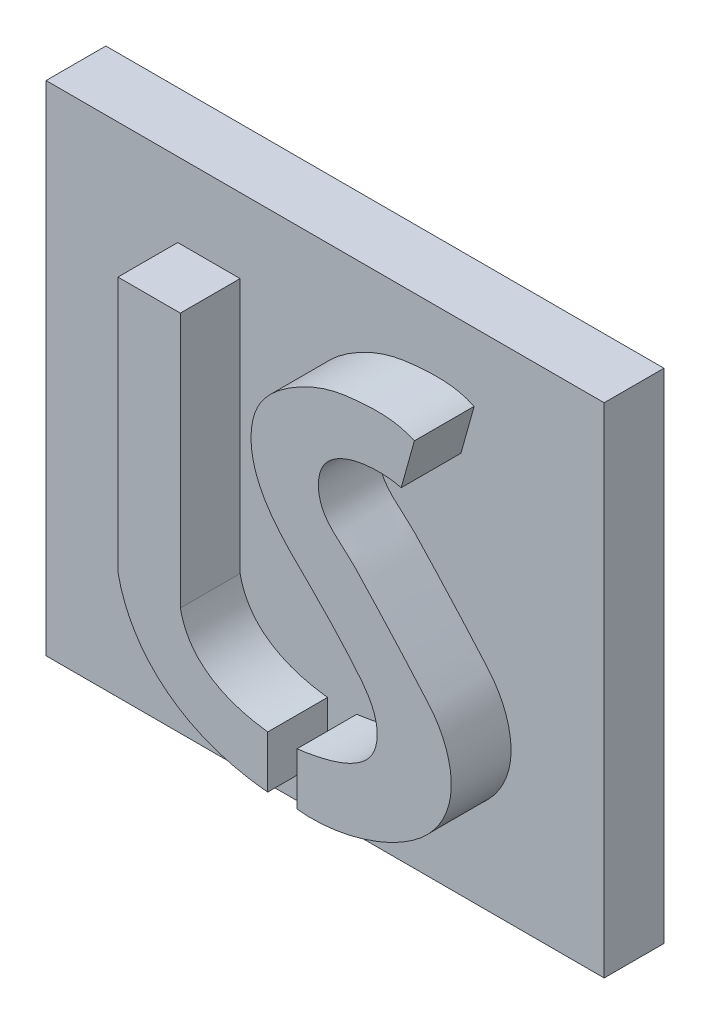
ISO-10303-21;
HEADER;
FILE_DESCRIPTION(('STEP AP214'),'2;1');
FILE_NAME('part.step','',(''),(''),'','','');
FILE_SCHEMA(('AUTOMOTIVE_DESIGN { 1 0 10303 214 1 1 1 1 }'));
ENDSEC;
DATA;
#1=APPLICATION_CONTEXT('core data for automotive mechanical design processes');
#2=APPLICATION_PROTOCOL_DEFINITION('international standard','automotive_design',2000,#1);
#3=PRODUCT_CONTEXT('',#1,'mechanical');
#4=PRODUCT('Part','Part','',(#3));
#5=PRODUCT_RELATED_PRODUCT_CATEGORY('part','',(#4));
#6=PRODUCT_DEFINITION_FORMATION('','',#4);
#7=PRODUCT_DEFINITION_CONTEXT('part definition',#1,'design');
#8=PRODUCT_DEFINITION('design','',#6,#7);
#9=PRODUCT_DEFINITION_SHAPE('','',#8);
#10=(LENGTH_UNIT() NAMED_UNIT(*) SI_UNIT(.MILLI.,.METRE.));
#11=(NAMED_UNIT(*) PLANE_ANGLE_UNIT() SI_UNIT($,.RADIAN.));
#12=(NAMED_UNIT(*) SI_UNIT($,.STERADIAN.) SOLID_ANGLE_UNIT());
#13=UNCERTAINTY_MEASURE_WITH_UNIT(LENGTH_MEASURE(1.E-05),#10,'distance_accuracy_value','');
#14=(GEOMETRIC_REPRESENTATION_CONTEXT(3) GLOBAL_UNCERTAINTY_ASSIGNED_CONTEXT((#13)) GLOBAL_UNIT_ASSIGNED_CONTEXT((#10,
#11,#12)) REPRESENTATION_CONTEXT('',''));
#15=CARTESIAN_POINT('',(0.,0.,0.));
#16=DIRECTION('',(0.,0.,1.));
#17=DIRECTION('',(1.,0.,0.));
#18=AXIS2_PLACEMENT_3D('',#15,#16,#17);
#19=CARTESIAN_POINT('',(-29.5826925903919,-8.44385926575013,3.));
#20=DIRECTION('',(0.,0.,1.));
#21=DIRECTION('',(1.,0.,0.));
#22=AXIS2_PLACEMENT_3D('',#19,#20,#21);
#23=PLANE('',#22);
#24=CARTESIAN_POINT('',(-22.9765195134115,0.,3.));
#25=CARTESIAN_POINT('',(-22.3429501642993,-3.11942697674456,3.));
#26=CARTESIAN_POINT('',(-19.6728785197625,-5.43023383071438,3.));
#27=CARTESIAN_POINT('',(-15.4592463577573,-5.80732246234798,3.));
#28=B_SPLINE_CURVE_WITH_KNOTS('',3,(#24,#25,#26,#27),.UNSPECIFIED.,.F.,.F.,(4,4),(0.,1.),.UNSPECIFIED.);
#29=CARTESIAN_POINT('',(-22.9765195134115,0.,3.));
#30=VERTEX_POINT('',#29);
#31=CARTESIAN_POINT('',(-15.4592463577573,-5.80732246234798,3.));
#32=VERTEX_POINT('',#31);
#33=EDGE_CURVE('E163',#30,#32,#28,.T.);
#34=ORIENTED_EDGE('',*,*,#33,.F.);
#35=DIRECTION('',(0.,-1.,0.));
#36=VECTOR('',#35,1.);
#37=CARTESIAN_POINT('',(-22.9765195134115,12.8177735507663,3.));
#38=LINE('',#37,#36);
#39=CARTESIAN_POINT('',(-22.9765195134115,12.8177735507663,3.));
#40=VERTEX_POINT('',#39);
#41=EDGE_CURVE('E160',#40,#30,#38,.T.);
#42=ORIENTED_EDGE('',*,*,#41,.F.);
#43=DIRECTION('',(-1.,0.,0.));
#44=VECTOR('',#43,1.);
#45=CARTESIAN_POINT('',(-22.9765195134115,12.8177735507663,3.));
#46=LINE('',#45,#44);
#47=CARTESIAN_POINT('',(-19.8443223652222,12.8177735507663,3.));
#48=VERTEX_POINT('',#47);
#49=EDGE_CURVE('E172',#48,#40,#46,.T.);
#50=ORIENTED_EDGE('',*,*,#49,.F.);
#51=DIRECTION('',(0.,1.,0.));
#52=VECTOR('',#51,1.);
#53=CARTESIAN_POINT('',(-19.8443223652222,12.8177735507663,3.));
#54=LINE('',#53,#52);
#55=CARTESIAN_POINT('',(-19.8443223652222,0.,3.));
#56=VERTEX_POINT('',#55);
#57=EDGE_CURVE('E341',#56,#48,#54,.T.);
#58=ORIENTED_EDGE('',*,*,#57,.F.);
#59=CARTESIAN_POINT('',(-15.4592463577573,-3.19123409553421,3.));
#60=CARTESIAN_POINT('',(-18.4198953362337,-2.82839401007701,3.));
#61=CARTESIAN_POINT('',(-19.5543136151055,-1.44123784440447,3.));
#62=CARTESIAN_POINT('',(-19.8443223652222,0.,3.));
#63=B_SPLINE_CURVE_WITH_KNOTS('',3,(#59,#60,#61,#62),.UNSPECIFIED.,.F.,.F.,(4,4),(0.,1.),.UNSPECIFIED.);
#64=CARTESIAN_POINT('',(-15.4592463577573,-3.19123409553421,3.));
#65=VERTEX_POINT('',#64);
#66=EDGE_CURVE('E337',#65,#56,#63,.T.);
#67=ORIENTED_EDGE('',*,*,#66,.F.);
#68=DIRECTION('',(0.,1.,0.));
#69=VECTOR('',#68,1.);
#70=CARTESIAN_POINT('',(-15.4592463577573,-5.80732246234798,3.));
#71=LINE('',#70,#69);
#72=EDGE_CURVE('E332',#32,#65,#71,.T.);
#73=ORIENTED_EDGE('',*,*,#72,.F.);
#74=EDGE_LOOP('',(#34,#42,#50,#58,#67,#73));
#75=FACE_BOUND('',#74,.T.);
#76=DIRECTION('',(0.,-1.,0.));
#77=VECTOR('',#76,1.);
#78=CARTESIAN_POINT('',(-29.5826925903919,16.5561407342499,3.));
#79=LINE('',#78,#77);
#80=CARTESIAN_POINT('',(-29.5826925903919,16.5561407342499,3.));
#81=VERTEX_POINT('',#80);
#82=CARTESIAN_POINT('',(-29.5826925903919,-8.44385926575013,3.));
#83=VERTEX_POINT('',#82);
#84=EDGE_CURVE('E233',#81,#83,#79,.T.);
#85=ORIENTED_EDGE('',*,*,#84,.T.);
#86=DIRECTION('',(1.,0.,0.));
#87=VECTOR('',#86,1.);
#88=CARTESIAN_POINT('',(-29.5826925903919,-8.44385926575013,3.));
#89=LINE('',#88,#87);
#90=CARTESIAN_POINT('',(-1.57743360817238,-8.44385926575013,3.));
#91=VERTEX_POINT('',#90);
#92=EDGE_CURVE('E247',#83,#91,#89,.T.);
#93=ORIENTED_EDGE('',*,*,#92,.T.);
#94=DIRECTION('',(0.,1.,0.));
#95=VECTOR('',#94,1.);
#96=CARTESIAN_POINT('',(-1.57743360817238,16.5561407342499,3.));
#97=LINE('',#96,#95);
#98=CARTESIAN_POINT('',(-1.57743360817238,16.5561407342499,3.));
#99=VERTEX_POINT('',#98);
#100=EDGE_CURVE('E228',#91,#99,#97,.T.);
#101=ORIENTED_EDGE('',*,*,#100,.T.);
#102=DIRECTION('',(-1.,0.,0.));
#103=VECTOR('',#102,1.);
#104=CARTESIAN_POINT('',(-29.5826925903919,16.5561407342499,3.));
#105=LINE('',#104,#103);
#106=EDGE_CURVE('E240',#99,#81,#105,.T.);
#107=ORIENTED_EDGE('',*,*,#106,.T.);
#108=EDGE_LOOP('',(#85,#93,#101,#107));
#109=FACE_BOUND('',#108,.T.);
#110=DIRECTION('',(0.268798967813945,0.963196301333304,0.));
#111=VECTOR('',#110,1.);
#112=CARTESIAN_POINT('',(-8.7624334278442,10.7700605483656,3.));
#113=LINE('',#112,#111);
#114=CARTESIAN_POINT('',(-8.7624334278442,10.7700605483656,3.));
#115=VERTEX_POINT('',#114);
#116=CARTESIAN_POINT('',(-8.10172784651106,13.137588881476,3.));
#117=VERTEX_POINT('',#116);
#118=EDGE_CURVE('E261',#115,#117,#113,.T.);
#119=ORIENTED_EDGE('',*,*,#118,.F.);
#120=CARTESIAN_POINT('',(-13.9930192800649,-5.80732246234798,3.));
#121=CARTESIAN_POINT('',(-11.9839659853003,-6.05433101773536,3.));
#122=CARTESIAN_POINT('',(-7.97562640166888,-4.84318381194574,3.));
#123=CARTESIAN_POINT('',(-6.41692562082773,-2.34626485384229,3.));
#124=CARTESIAN_POINT('',(-6.14186244538643,-0.442680706746581,3.));
#125=CARTESIAN_POINT('',(-6.57837550047113,1.12461989580706,3.));
#126=CARTESIAN_POINT('',(-8.61186699052037,3.47877203101136,3.));
#127=CARTESIAN_POINT('',(-9.73750942511831,4.70756901315383,3.));
#128=CARTESIAN_POINT('',(-11.5566524553808,6.6734283439871,3.));
#129=CARTESIAN_POINT('',(-12.951560908196,7.60981912584689,3.));
#130=CARTESIAN_POINT('',(-13.0064858148123,9.7895302217087,3.));
#131=CARTESIAN_POINT('',(-11.2133193186636,11.0081482727677,3.));
#132=CARTESIAN_POINT('',(-9.39788975937952,10.9473971990266,3.));
#133=CARTESIAN_POINT('',(-8.7624334278442,10.7700605483656,3.));
#134=B_SPLINE_CURVE_WITH_KNOTS('',3,(#120,#121,#122,#123,#124,#125,#126,#127,#128,#129,#130,
#131,#132,#133),.UNSPECIFIED.,.F.,.F.,(4,1,1,1,1,1,1,1,1,1,1,4),(0.,0.199547372977158,
0.300843584674083,0.326269257012473,0.428378424022668,0.465295503558659,0.658522972836398,
0.691498048738816,0.770892828923119,0.837392887247091,0.898086999486631,1.),.UNSPECIFIED.);
#135=CARTESIAN_POINT('',(-13.9930192800649,-5.80732246234798,3.));
#136=VERTEX_POINT('',#135);
#137=EDGE_CURVE('E158',#136,#115,#134,.T.);
#138=ORIENTED_EDGE('',*,*,#137,.F.);
#139=DIRECTION('',(0.,-1.,0.));
#140=VECTOR('',#139,1.);
#141=CARTESIAN_POINT('',(-13.9930192800649,-3.19123409553421,3.));
#142=LINE('',#141,#140);
#143=CARTESIAN_POINT('',(-13.9930192800649,-3.19123409553421,3.));
#144=VERTEX_POINT('',#143);
#145=EDGE_CURVE('E154',#144,#136,#142,.T.);
#146=ORIENTED_EDGE('',*,*,#145,.F.);
#147=CARTESIAN_POINT('',(-8.10172784651106,13.137588881476,3.));
#148=CARTESIAN_POINT('',(-8.92482833659311,13.5189323684147,3.));
#149=CARTESIAN_POINT('',(-10.3336570477235,13.5345127960297,3.));
#150=CARTESIAN_POINT('',(-12.469375349314,13.2846881459409,3.));
#151=CARTESIAN_POINT('',(-14.3642771918677,12.4378341736718,3.));
#152=CARTESIAN_POINT('',(-16.1970350014759,10.8959657458683,3.));
#153=CARTESIAN_POINT('',(-16.4329048290198,8.5121889487889,3.));
#154=CARTESIAN_POINT('',(-15.4102913443083,6.1855625168523,3.));
#155=CARTESIAN_POINT('',(-13.2808511957244,4.22165771458455,3.));
#156=CARTESIAN_POINT('',(-11.3571842829028,2.17038432709639,3.));
#157=CARTESIAN_POINT('',(-9.88647667912001,0.330842149799267,3.));
#158=CARTESIAN_POINT('',(-10.0232360565103,-2.58947903004189,3.));
#159=CARTESIAN_POINT('',(-12.9475231240408,-3.04635590726591,3.));
#160=CARTESIAN_POINT('',(-13.9930192800649,-3.19123409553421,3.));
#161=B_SPLINE_CURVE_WITH_KNOTS('',3,(#147,#148,#149,#150,#151,#152,#153,#154,#155,#156,#157,
#158,#159,#160),.UNSPECIFIED.,.F.,.F.,(4,1,1,1,1,1,1,1,1,1,1,4),(0.,0.0959751847192169,
0.152801719733179,0.233791993128749,0.321873122400391,0.398877795270022,0.476755317251711,
0.592890402931204,0.710882461862937,0.789460509483729,0.840629791422254,1.),.UNSPECIFIED.);
#162=EDGE_CURVE('E263',#117,#144,#161,.T.);
#163=ORIENTED_EDGE('',*,*,#162,.F.);
#164=EDGE_LOOP('',(#119,#138,#146,#163));
#165=FACE_BOUND('',#164,.T.);
#166=ADVANCED_FACE('F33',(#75,#109,#165),#23,.T.);
#167=CARTESIAN_POINT('',(-29.5826925903919,16.5561407342499,3.));
#168=DIRECTION('',(1.,0.,0.));
#169=DIRECTION('',(0.,1.,0.));
#170=AXIS2_PLACEMENT_3D('',#167,#168,#169);
#171=PLANE('',#170);
#172=DIRECTION('',(0.,-1.,0.));
#173=VECTOR('',#172,1.);
#174=CARTESIAN_POINT('',(-29.5826925903919,16.5561407342499,0.));
#175=LINE('',#174,#173);
#176=CARTESIAN_POINT('',(-29.5826925903919,16.5561407342499,0.));
#177=VERTEX_POINT('',#176);
#178=CARTESIAN_POINT('',(-29.5826925903919,-8.44385926575013,0.));
#179=VERTEX_POINT('',#178);
#180=EDGE_CURVE('E224',#177,#179,#175,.T.);
#181=ORIENTED_EDGE('',*,*,#180,.T.);
#182=DIRECTION('',(0.,0.,-1.));
#183=VECTOR('',#182,1.);
#184=CARTESIAN_POINT('',(-29.5826925903919,-8.44385926575013,3.));
#185=LINE('',#184,#183);
#186=EDGE_CURVE('E11',#83,#179,#185,.T.);
#187=ORIENTED_EDGE('',*,*,#186,.F.);
#188=ORIENTED_EDGE('',*,*,#84,.F.);
#189=DIRECTION('',(0.,0.,-1.));
#190=VECTOR('',#189,1.);
#191=CARTESIAN_POINT('',(-29.5826925903919,16.5561407342499,3.));
#192=LINE('',#191,#190);
#193=EDGE_CURVE('E237',#81,#177,#192,.T.);
#194=ORIENTED_EDGE('',*,*,#193,.T.);
#195=EDGE_LOOP('',(#181,#187,#188,#194));
#196=FACE_BOUND('',#195,.T.);
#197=ADVANCED_FACE('F35',(#196),#171,.F.);
#198=CARTESIAN_POINT('',(-29.5826925903919,-8.44385926575013,3.));
#199=DIRECTION('',(0.,1.,0.));
#200=DIRECTION('',(0.,0.,1.));
#201=AXIS2_PLACEMENT_3D('',#198,#199,#200);
#202=PLANE('',#201);
#203=DIRECTION('',(1.,0.,0.));
#204=VECTOR('',#203,1.);
#205=CARTESIAN_POINT('',(-29.5826925903919,-8.44385926575013,0.));
#206=LINE('',#205,#204);
#207=CARTESIAN_POINT('',(-1.57743360817238,-8.44385926575013,0.));
#208=VERTEX_POINT('',#207);
#209=EDGE_CURVE('E216',#179,#208,#206,.T.);
#210=ORIENTED_EDGE('',*,*,#209,.T.);
#211=DIRECTION('',(0.,0.,-1.));
#212=VECTOR('',#211,1.);
#213=CARTESIAN_POINT('',(-1.57743360817238,-8.44385926575013,3.));
#214=LINE('',#213,#212);
#215=EDGE_CURVE('E41',#91,#208,#214,.T.);
#216=ORIENTED_EDGE('',*,*,#215,.F.);
#217=ORIENTED_EDGE('',*,*,#92,.F.);
#218=ORIENTED_EDGE('',*,*,#186,.T.);
#219=EDGE_LOOP('',(#210,#216,#217,#218));
#220=FACE_BOUND('',#219,.T.);
#221=ADVANCED_FACE('F207',(#220),#202,.F.);
#222=CARTESIAN_POINT('',(-1.57743360817238,16.5561407342499,3.));
#223=DIRECTION('',(-1.,0.,0.));
#224=DIRECTION('',(0.,-1.,0.));
#225=AXIS2_PLACEMENT_3D('',#222,#223,#224);
#226=PLANE('',#225);
#227=DIRECTION('',(0.,1.,0.));
#228=VECTOR('',#227,1.);
#229=CARTESIAN_POINT('',(-1.57743360817238,16.5561407342499,0.));
#230=LINE('',#229,#228);
#231=CARTESIAN_POINT('',(-1.57743360817238,16.5561407342499,0.));
#232=VERTEX_POINT('',#231);
#233=EDGE_CURVE('E223',#208,#232,#230,.T.);
#234=ORIENTED_EDGE('',*,*,#233,.T.);
#235=DIRECTION('',(0.,0.,-1.));
#236=VECTOR('',#235,1.);
#237=CARTESIAN_POINT('',(-1.57743360817238,16.5561407342499,3.));
#238=LINE('',#237,#236);
#239=EDGE_CURVE('E229',#99,#232,#238,.T.);
#240=ORIENTED_EDGE('',*,*,#239,.F.);
#241=ORIENTED_EDGE('',*,*,#100,.F.);
#242=ORIENTED_EDGE('',*,*,#215,.T.);
#243=EDGE_LOOP('',(#234,#240,#241,#242));
#244=FACE_BOUND('',#243,.T.);
#245=ADVANCED_FACE('F204',(#244),#226,.F.);
#246=CARTESIAN_POINT('',(-29.5826925903919,16.5561407342499,3.));
#247=DIRECTION('',(0.,-1.,0.));
#248=DIRECTION('',(0.,0.,-1.));
#249=AXIS2_PLACEMENT_3D('',#246,#247,#248);
#250=PLANE('',#249);
#251=DIRECTION('',(-1.,0.,0.));
#252=VECTOR('',#251,1.);
#253=CARTESIAN_POINT('',(-29.5826925903919,16.5561407342499,0.));
#254=LINE('',#253,#252);
#255=EDGE_CURVE('E231',#232,#177,#254,.T.);
#256=ORIENTED_EDGE('',*,*,#255,.T.);
#257=ORIENTED_EDGE('',*,*,#193,.F.);
#258=ORIENTED_EDGE('',*,*,#106,.F.);
#259=ORIENTED_EDGE('',*,*,#239,.T.);
#260=EDGE_LOOP('',(#256,#257,#258,#259));
#261=FACE_BOUND('',#260,.T.);
#262=ADVANCED_FACE('F200',(#261),#250,.F.);
#263=CARTESIAN_POINT('',(-29.5826925903919,-8.44385926575013,0.));
#264=DIRECTION('',(0.,0.,1.));
#265=DIRECTION('',(1.,0.,0.));
#266=AXIS2_PLACEMENT_3D('',#263,#264,#265);
#267=PLANE('',#266);
#268=ORIENTED_EDGE('',*,*,#180,.F.);
#269=ORIENTED_EDGE('',*,*,#255,.F.);
#270=ORIENTED_EDGE('',*,*,#233,.F.);
#271=ORIENTED_EDGE('',*,*,#209,.F.);
#272=EDGE_LOOP('',(#268,#269,#270,#271));
#273=FACE_BOUND('',#272,.T.);
#274=ADVANCED_FACE('F193',(#273),#267,.F.);
#275=CARTESIAN_POINT('',(-22.9765195134115,12.8177735507663,6.));
#276=DIRECTION('',(1.,0.,0.));
#277=DIRECTION('',(0.,0.,-1.));
#278=AXIS2_PLACEMENT_3D('',#275,#276,#277);
#279=PLANE('',#278);
#280=ORIENTED_EDGE('',*,*,#41,.T.);
#281=DIRECTION('',(0.,0.,-1.));
#282=VECTOR('',#281,1.);
#283=CARTESIAN_POINT('',(-22.9765195134115,0.,6.));
#284=LINE('',#283,#282);
#285=CARTESIAN_POINT('',(-22.9765195134115,0.,6.));
#286=VERTEX_POINT('',#285);
#287=EDGE_CURVE('E250',#286,#30,#284,.T.);
#288=ORIENTED_EDGE('',*,*,#287,.F.);
#289=DIRECTION('',(0.,-1.,0.));
#290=VECTOR('',#289,1.);
#291=CARTESIAN_POINT('',(-22.9765195134115,12.8177735507663,6.));
#292=LINE('',#291,#290);
#293=CARTESIAN_POINT('',(-22.9765195134115,12.8177735507663,6.));
#294=VERTEX_POINT('',#293);
#295=EDGE_CURVE('E168',#294,#286,#292,.T.);
#296=ORIENTED_EDGE('',*,*,#295,.F.);
#297=DIRECTION('',(0.,0.,-1.));
#298=VECTOR('',#297,1.);
#299=CARTESIAN_POINT('',(-22.9765195134115,12.8177735507663,6.));
#300=LINE('',#299,#298);
#301=EDGE_CURVE('E327',#294,#40,#300,.T.);
#302=ORIENTED_EDGE('',*,*,#301,.T.);
#303=EDGE_LOOP('',(#280,#288,#296,#302));
#304=FACE_BOUND('',#303,.T.);
#305=ADVANCED_FACE('F188',(#304),#279,.F.);
#306=CARTESIAN_POINT('',(-22.9765195134115,0.,6.));
#307=CARTESIAN_POINT('',(-22.3429501642993,-3.11942697674456,6.));
#308=CARTESIAN_POINT('',(-19.6728785197625,-5.43023383071438,6.));
#309=CARTESIAN_POINT('',(-15.4592463577573,-5.80732246234798,6.));
#310=B_SPLINE_CURVE_WITH_KNOTS('',3,(#306,#307,#308,#309),.UNSPECIFIED.,.F.,.F.,(4,4),(0.,1.),.UNSPECIFIED.);
#311=DIRECTION('',(0.,0.,-1.));
#312=VECTOR('',#311,1.);
#313=SURFACE_OF_LINEAR_EXTRUSION('',#310,#312);
#314=ORIENTED_EDGE('',*,*,#33,.T.);
#315=DIRECTION('',(0.,0.,-1.));
#316=VECTOR('',#315,1.);
#317=CARTESIAN_POINT('',(-15.4592463577573,-5.80732246234798,6.));
#318=LINE('',#317,#316);
#319=CARTESIAN_POINT('',(-15.4592463577573,-5.80732246234798,6.));
#320=VERTEX_POINT('',#319);
#321=EDGE_CURVE('E251',#320,#32,#318,.T.);
#322=ORIENTED_EDGE('',*,*,#321,.F.);
#323=EDGE_CURVE('E171',#286,#320,#310,.T.);
#324=ORIENTED_EDGE('',*,*,#323,.F.);
#325=ORIENTED_EDGE('',*,*,#287,.T.);
#326=EDGE_LOOP('',(#314,#322,#324,#325));
#327=FACE_BOUND('',#326,.T.);
#328=ADVANCED_FACE('F183',(#327),#313,.F.);
#329=CARTESIAN_POINT('',(-15.4592463577573,-5.80732246234798,6.));
#330=DIRECTION('',(-1.,0.,0.));
#331=DIRECTION('',(0.,0.,1.));
#332=AXIS2_PLACEMENT_3D('',#329,#330,#331);
#333=PLANE('',#332);
#334=ORIENTED_EDGE('',*,*,#72,.T.);
#335=DIRECTION('',(0.,0.,-1.));
#336=VECTOR('',#335,1.);
#337=CARTESIAN_POINT('',(-15.4592463577573,-3.19123409553421,6.));
#338=LINE('',#337,#336);
#339=CARTESIAN_POINT('',(-15.4592463577573,-3.19123409553421,6.));
#340=VERTEX_POINT('',#339);
#341=EDGE_CURVE('E255',#340,#65,#338,.T.);
#342=ORIENTED_EDGE('',*,*,#341,.F.);
#343=DIRECTION('',(0.,1.,0.));
#344=VECTOR('',#343,1.);
#345=CARTESIAN_POINT('',(-15.4592463577573,-5.80732246234798,6.));
#346=LINE('',#345,#344);
#347=EDGE_CURVE('E177',#320,#340,#346,.T.);
#348=ORIENTED_EDGE('',*,*,#347,.F.);
#349=ORIENTED_EDGE('',*,*,#321,.T.);
#350=EDGE_LOOP('',(#334,#342,#348,#349));
#351=FACE_BOUND('',#350,.T.);
#352=ADVANCED_FACE('F187',(#351),#333,.F.);
#353=CARTESIAN_POINT('',(-15.4592463577573,-3.19123409553421,6.));
#354=CARTESIAN_POINT('',(-18.4198953362337,-2.82839401007701,6.));
#355=CARTESIAN_POINT('',(-19.5543136151055,-1.44123784440447,6.));
#356=CARTESIAN_POINT('',(-19.8443223652222,0.,6.));
#357=B_SPLINE_CURVE_WITH_KNOTS('',3,(#353,#354,#355,#356),.UNSPECIFIED.,.F.,.F.,(4,4),(0.,1.),.UNSPECIFIED.);
#358=DIRECTION('',(0.,0.,-1.));
#359=VECTOR('',#358,1.);
#360=SURFACE_OF_LINEAR_EXTRUSION('',#357,#359);
#361=ORIENTED_EDGE('',*,*,#66,.T.);
#362=DIRECTION('',(0.,0.,-1.));
#363=VECTOR('',#362,1.);
#364=CARTESIAN_POINT('',(-19.8443223652222,0.,6.));
#365=LINE('',#364,#363);
#366=CARTESIAN_POINT('',(-19.8443223652222,0.,6.));
#367=VERTEX_POINT('',#366);
#368=EDGE_CURVE('E350',#367,#56,#365,.T.);
#369=ORIENTED_EDGE('',*,*,#368,.F.);
#370=EDGE_CURVE('E316',#340,#367,#357,.T.);
#371=ORIENTED_EDGE('',*,*,#370,.F.);
#372=ORIENTED_EDGE('',*,*,#341,.T.);
#373=EDGE_LOOP('',(#361,#369,#371,#372));
#374=FACE_BOUND('',#373,.T.);
#375=ADVANCED_FACE('F312',(#374),#360,.F.);
#376=CARTESIAN_POINT('',(-19.8443223652222,12.8177735507663,6.));
#377=DIRECTION('',(-1.,0.,0.));
#378=DIRECTION('',(0.,0.,1.));
#379=AXIS2_PLACEMENT_3D('',#376,#377,#378);
#380=PLANE('',#379);
#381=ORIENTED_EDGE('',*,*,#57,.T.);
#382=DIRECTION('',(0.,0.,-1.));
#383=VECTOR('',#382,1.);
#384=CARTESIAN_POINT('',(-19.8443223652222,12.8177735507663,6.));
#385=LINE('',#384,#383);
#386=CARTESIAN_POINT('',(-19.8443223652222,12.8177735507663,6.));
#387=VERTEX_POINT('',#386);
#388=EDGE_CURVE('E56',#387,#48,#385,.T.);
#389=ORIENTED_EDGE('',*,*,#388,.F.);
#390=DIRECTION('',(0.,1.,0.));
#391=VECTOR('',#390,1.);
#392=CARTESIAN_POINT('',(-19.8443223652222,12.8177735507663,6.));
#393=LINE('',#392,#391);
#394=EDGE_CURVE('E321',#367,#387,#393,.T.);
#395=ORIENTED_EDGE('',*,*,#394,.F.);
#396=ORIENTED_EDGE('',*,*,#368,.T.);
#397=EDGE_LOOP('',(#381,#389,#395,#396));
#398=FACE_BOUND('',#397,.T.);
#399=ADVANCED_FACE('F310',(#398),#380,.F.);
#400=CARTESIAN_POINT('',(-22.9765195134115,12.8177735507663,6.));
#401=DIRECTION('',(0.,-1.,0.));
#402=DIRECTION('',(0.,0.,-1.));
#403=AXIS2_PLACEMENT_3D('',#400,#401,#402);
#404=PLANE('',#403);
#405=ORIENTED_EDGE('',*,*,#49,.T.);
#406=ORIENTED_EDGE('',*,*,#301,.F.);
#407=DIRECTION('',(-1.,0.,0.));
#408=VECTOR('',#407,1.);
#409=CARTESIAN_POINT('',(-22.9765195134115,12.8177735507663,6.));
#410=LINE('',#409,#408);
#411=EDGE_CURVE('E326',#387,#294,#410,.T.);
#412=ORIENTED_EDGE('',*,*,#411,.F.);
#413=ORIENTED_EDGE('',*,*,#388,.T.);
#414=EDGE_LOOP('',(#405,#406,#412,#413));
#415=FACE_BOUND('',#414,.T.);
#416=ADVANCED_FACE('F306',(#415),#404,.F.);
#417=CARTESIAN_POINT('',(-20.5604064904193,-3.9320381105906,6.));
#418=DIRECTION('',(0.,0.,-1.));
#419=DIRECTION('',(-1.,0.,0.));
#420=AXIS2_PLACEMENT_3D('',#417,#418,#419);
#421=PLANE('',#420);
#422=ORIENTED_EDGE('',*,*,#295,.T.);
#423=ORIENTED_EDGE('',*,*,#323,.T.);
#424=ORIENTED_EDGE('',*,*,#347,.T.);
#425=ORIENTED_EDGE('',*,*,#370,.T.);
#426=ORIENTED_EDGE('',*,*,#394,.T.);
#427=ORIENTED_EDGE('',*,*,#411,.T.);
#428=EDGE_LOOP('',(#422,#423,#424,#425,#426,#427));
#429=FACE_BOUND('',#428,.T.);
#430=ADVANCED_FACE('F297',(#429),#421,.F.);
#431=CARTESIAN_POINT('',(-13.9930192800649,-5.80732246234798,6.));
#432=CARTESIAN_POINT('',(-11.9839659853003,-6.05433101773536,6.));
#433=CARTESIAN_POINT('',(-7.97562640166888,-4.84318381194574,6.));
#434=CARTESIAN_POINT('',(-6.41692562082773,-2.34626485384229,6.));
#435=CARTESIAN_POINT('',(-6.14186244538643,-0.442680706746581,6.));
#436=CARTESIAN_POINT('',(-6.57837550047113,1.12461989580706,6.));
#437=CARTESIAN_POINT('',(-8.61186699052037,3.47877203101136,6.));
#438=CARTESIAN_POINT('',(-9.73750942511831,4.70756901315383,6.));
#439=CARTESIAN_POINT('',(-11.5566524553808,6.6734283439871,6.));
#440=CARTESIAN_POINT('',(-12.951560908196,7.60981912584689,6.));
#441=CARTESIAN_POINT('',(-13.0064858148123,9.7895302217087,6.));
#442=CARTESIAN_POINT('',(-11.2133193186636,11.0081482727677,6.));
#443=CARTESIAN_POINT('',(-9.39788975937952,10.9473971990266,6.));
#444=CARTESIAN_POINT('',(-8.7624334278442,10.7700605483656,6.));
#445=B_SPLINE_CURVE_WITH_KNOTS('',3,(#431,#432,#433,#434,#435,#436,#437,#438,#439,#440,#441,
#442,#443,#444),.UNSPECIFIED.,.F.,.F.,(4,1,1,1,1,1,1,1,1,1,1,4),(0.,0.199547372977158,
0.300843584674083,0.326269257012473,0.428378424022668,0.465295503558659,0.658522972836398,
0.691498048738816,0.770892828923119,0.837392887247091,0.898086999486631,1.),.UNSPECIFIED.);
#446=DIRECTION('',(0.,0.,-1.));
#447=VECTOR('',#446,1.);
#448=SURFACE_OF_LINEAR_EXTRUSION('',#445,#447);
#449=ORIENTED_EDGE('',*,*,#137,.T.);
#450=DIRECTION('',(0.,0.,-1.));
#451=VECTOR('',#450,1.);
#452=CARTESIAN_POINT('',(-8.7624334278442,10.7700605483656,6.));
#453=LINE('',#452,#451);
#454=CARTESIAN_POINT('',(-8.7624334278442,10.7700605483656,6.));
#455=VERTEX_POINT('',#454);
#456=EDGE_CURVE('E139',#455,#115,#453,.T.);
#457=ORIENTED_EDGE('',*,*,#456,.F.);
#458=CARTESIAN_POINT('',(-13.9930192800649,-5.80732246234798,6.));
#459=VERTEX_POINT('',#458);
#460=EDGE_CURVE('E146',#459,#455,#445,.T.);
#461=ORIENTED_EDGE('',*,*,#460,.F.);
#462=DIRECTION('',(0.,0.,-1.));
#463=VECTOR('',#462,1.);
#464=CARTESIAN_POINT('',(-13.9930192800649,-5.80732246234798,6.));
#465=LINE('',#464,#463);
#466=EDGE_CURVE('E277',#459,#136,#465,.T.);
#467=ORIENTED_EDGE('',*,*,#466,.T.);
#468=EDGE_LOOP('',(#449,#457,#461,#467));
#469=FACE_BOUND('',#468,.T.);
#470=ADVANCED_FACE('F156',(#469),#448,.F.);
#471=CARTESIAN_POINT('',(-8.7624334278442,10.7700605483656,6.));
#472=DIRECTION('',(-0.963196301333304,0.268798967813945,0.));
#473=DIRECTION('',(-0.268798967813945,-0.963196301333305,0.));
#474=AXIS2_PLACEMENT_3D('',#471,#472,#473);
#475=PLANE('',#474);
#476=ORIENTED_EDGE('',*,*,#118,.T.);
#477=DIRECTION('',(0.,0.,-1.));
#478=VECTOR('',#477,1.);
#479=CARTESIAN_POINT('',(-8.10172784651106,13.137588881476,6.));
#480=LINE('',#479,#478);
#481=CARTESIAN_POINT('',(-8.10172784651106,13.137588881476,6.));
#482=VERTEX_POINT('',#481);
#483=EDGE_CURVE('E142',#482,#117,#480,.T.);
#484=ORIENTED_EDGE('',*,*,#483,.F.);
#485=DIRECTION('',(0.268798967813945,0.963196301333304,0.));
#486=VECTOR('',#485,1.);
#487=CARTESIAN_POINT('',(-8.7624334278442,10.7700605483656,6.));
#488=LINE('',#487,#486);
#489=EDGE_CURVE('E135',#455,#482,#488,.T.);
#490=ORIENTED_EDGE('',*,*,#489,.F.);
#491=ORIENTED_EDGE('',*,*,#456,.T.);
#492=EDGE_LOOP('',(#476,#484,#490,#491));
#493=FACE_BOUND('',#492,.T.);
#494=ADVANCED_FACE('F137',(#493),#475,.F.);
#495=CARTESIAN_POINT('',(-8.10172784651106,13.137588881476,6.));
#496=CARTESIAN_POINT('',(-8.92482833659311,13.5189323684147,6.));
#497=CARTESIAN_POINT('',(-10.3336570477235,13.5345127960297,6.));
#498=CARTESIAN_POINT('',(-12.469375349314,13.2846881459409,6.));
#499=CARTESIAN_POINT('',(-14.3642771918677,12.4378341736718,6.));
#500=CARTESIAN_POINT('',(-16.1970350014759,10.8959657458683,6.));
#501=CARTESIAN_POINT('',(-16.4329048290198,8.5121889487889,6.));
#502=CARTESIAN_POINT('',(-15.4102913443083,6.1855625168523,6.));
#503=CARTESIAN_POINT('',(-13.2808511957244,4.22165771458455,6.));
#504=CARTESIAN_POINT('',(-11.3571842829028,2.17038432709639,6.));
#505=CARTESIAN_POINT('',(-9.88647667912001,0.330842149799267,6.));
#506=CARTESIAN_POINT('',(-10.0232360565103,-2.58947903004189,6.));
#507=CARTESIAN_POINT('',(-12.9475231240408,-3.04635590726591,6.));
#508=CARTESIAN_POINT('',(-13.9930192800649,-3.19123409553421,6.));
#509=B_SPLINE_CURVE_WITH_KNOTS('',3,(#495,#496,#497,#498,#499,#500,#501,#502,#503,#504,#505,
#506,#507,#508),.UNSPECIFIED.,.F.,.F.,(4,1,1,1,1,1,1,1,1,1,1,4),(0.,0.0959751847192169,
0.152801719733179,0.233791993128749,0.321873122400391,0.398877795270022,0.476755317251711,
0.592890402931204,0.710882461862937,0.789460509483729,0.840629791422254,1.),.UNSPECIFIED.);
#510=DIRECTION('',(0.,0.,-1.));
#511=VECTOR('',#510,1.);
#512=SURFACE_OF_LINEAR_EXTRUSION('',#509,#511);
#513=ORIENTED_EDGE('',*,*,#162,.T.);
#514=DIRECTION('',(0.,0.,-1.));
#515=VECTOR('',#514,1.);
#516=CARTESIAN_POINT('',(-13.9930192800649,-3.19123409553421,6.));
#517=LINE('',#516,#515);
#518=CARTESIAN_POINT('',(-13.9930192800649,-3.19123409553421,6.));
#519=VERTEX_POINT('',#518);
#520=EDGE_CURVE('E48',#519,#144,#517,.T.);
#521=ORIENTED_EDGE('',*,*,#520,.F.);
#522=EDGE_CURVE('E145',#482,#519,#509,.T.);
#523=ORIENTED_EDGE('',*,*,#522,.F.);
#524=ORIENTED_EDGE('',*,*,#483,.T.);
#525=EDGE_LOOP('',(#513,#521,#523,#524));
#526=FACE_BOUND('',#525,.T.);
#527=ADVANCED_FACE('F286',(#526),#512,.F.);
#528=CARTESIAN_POINT('',(-13.9930192800649,-3.19123409553421,6.));
#529=DIRECTION('',(1.,0.,0.));
#530=DIRECTION('',(0.,0.,-1.));
#531=AXIS2_PLACEMENT_3D('',#528,#529,#530);
#532=PLANE('',#531);
#533=ORIENTED_EDGE('',*,*,#145,.T.);
#534=ORIENTED_EDGE('',*,*,#466,.F.);
#535=DIRECTION('',(0.,-1.,0.));
#536=VECTOR('',#535,1.);
#537=CARTESIAN_POINT('',(-13.9930192800649,-3.19123409553421,6.));
#538=LINE('',#537,#536);
#539=EDGE_CURVE('E150',#519,#459,#538,.T.);
#540=ORIENTED_EDGE('',*,*,#539,.F.);
#541=ORIENTED_EDGE('',*,*,#520,.T.);
#542=EDGE_LOOP('',(#533,#534,#540,#541));
#543=FACE_BOUND('',#542,.T.);
#544=ADVANCED_FACE('F290',(#543),#532,.F.);
#545=CARTESIAN_POINT('',(-8.22514103943939,3.02033223199287,6.));
#546=DIRECTION('',(0.,0.,-1.));
#547=DIRECTION('',(-1.,0.,0.));
#548=AXIS2_PLACEMENT_3D('',#545,#546,#547);
#549=PLANE('',#548);
#550=ORIENTED_EDGE('',*,*,#460,.T.);
#551=ORIENTED_EDGE('',*,*,#489,.T.);
#552=ORIENTED_EDGE('',*,*,#522,.T.);
#553=ORIENTED_EDGE('',*,*,#539,.T.);
#554=EDGE_LOOP('',(#550,#551,#552,#553));
#555=FACE_BOUND('',#554,.T.);
#556=ADVANCED_FACE('F149',(#555),#549,.F.);
#557=CLOSED_SHELL('',(#166,#197,#221,#245,#262,#274,#305,#328,#352,#375,#399,#416,#430,#470,
#494,#527,#544,#556));
#558=MANIFOLD_SOLID_BREP('B2',#557);
#559=ADVANCED_BREP_SHAPE_REPRESENTATION('',(#18,#558),#14);
#560=SHAPE_DEFINITION_REPRESENTATION(#9,#559);
ENDSEC;
END-ISO-10303-21;
